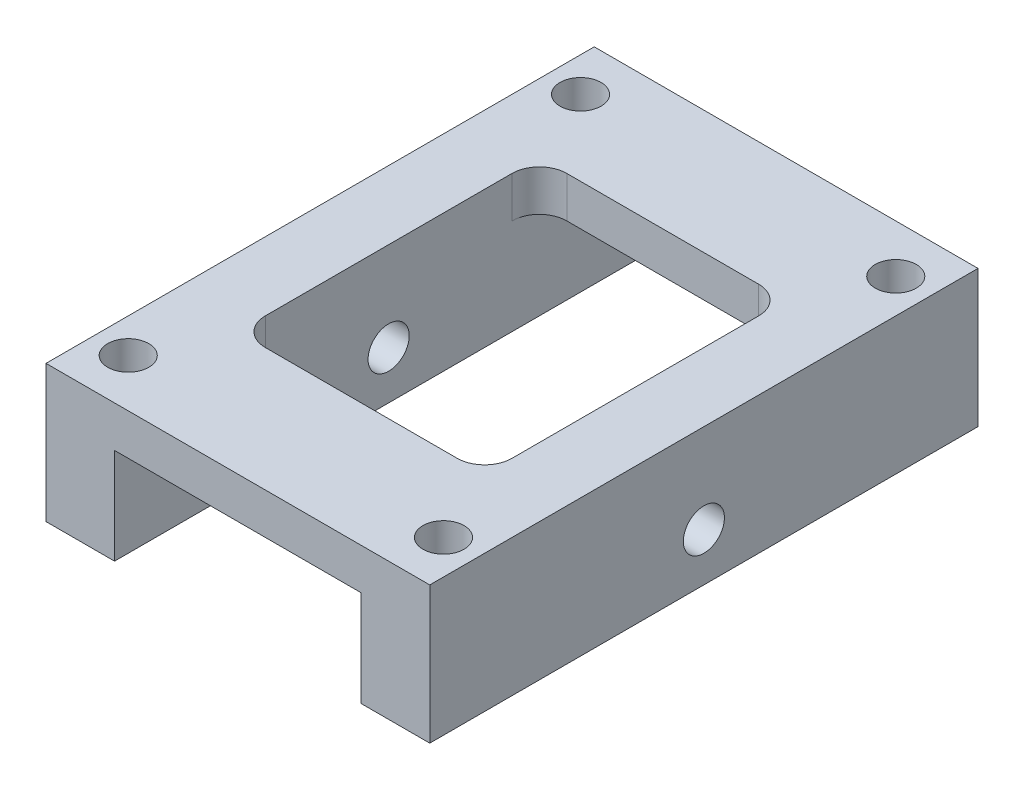
ISO-10303-21;
HEADER;
FILE_DESCRIPTION(('STEP AP214'),'2;1');
FILE_NAME('part.step','',(''),(''),'','','');
FILE_SCHEMA(('AUTOMOTIVE_DESIGN { 1 0 10303 214 1 1 1 1 }'));
ENDSEC;
DATA;
#1=APPLICATION_CONTEXT('core data for automotive mechanical design processes');
#2=APPLICATION_PROTOCOL_DEFINITION('international standard','automotive_design',2000,#1);
#3=PRODUCT_CONTEXT('',#1,'mechanical');
#4=PRODUCT('Part','Part','',(#3));
#5=PRODUCT_RELATED_PRODUCT_CATEGORY('part','',(#4));
#6=PRODUCT_DEFINITION_FORMATION('','',#4);
#7=PRODUCT_DEFINITION_CONTEXT('part definition',#1,'design');
#8=PRODUCT_DEFINITION('design','',#6,#7);
#9=PRODUCT_DEFINITION_SHAPE('','',#8);
#10=(LENGTH_UNIT() NAMED_UNIT(*) SI_UNIT(.MILLI.,.METRE.));
#11=(NAMED_UNIT(*) PLANE_ANGLE_UNIT() SI_UNIT($,.RADIAN.));
#12=(NAMED_UNIT(*) SI_UNIT($,.STERADIAN.) SOLID_ANGLE_UNIT());
#13=UNCERTAINTY_MEASURE_WITH_UNIT(LENGTH_MEASURE(1.E-05),#10,'distance_accuracy_value','');
#14=(GEOMETRIC_REPRESENTATION_CONTEXT(3) GLOBAL_UNCERTAINTY_ASSIGNED_CONTEXT((#13)) GLOBAL_UNIT_ASSIGNED_CONTEXT((#10,
#11,#12)) REPRESENTATION_CONTEXT('',''));
#15=CARTESIAN_POINT('',(0.,0.,0.));
#16=DIRECTION('',(0.,0.,1.));
#17=DIRECTION('',(1.,0.,0.));
#18=AXIS2_PLACEMENT_3D('',#15,#16,#17);
#19=CARTESIAN_POINT('',(23.,7.,40.));
#20=DIRECTION('',(0.,1.,0.));
#21=DIRECTION('',(-1.,0.,0.));
#22=AXIS2_PLACEMENT_3D('',#19,#20,#21);
#23=PLANE('',#22);
#24=DIRECTION('',(0.,0.,-1.));
#25=VECTOR('',#24,1.);
#26=CARTESIAN_POINT('',(5.,7.,40.));
#27=LINE('',#26,#25);
#28=CARTESIAN_POINT('',(5.,7.,40.));
#29=VERTEX_POINT('',#28);
#30=CARTESIAN_POINT('',(5.,7.,29.));
#31=VERTEX_POINT('',#30);
#32=EDGE_CURVE('E155',#29,#31,#27,.T.);
#33=ORIENTED_EDGE('',*,*,#32,.T.);
#34=CARTESIAN_POINT('',(7.,7.,29.));
#35=DIRECTION('',(0.,1.,0.));
#36=DIRECTION('',(-1.,0.,0.));
#37=AXIS2_PLACEMENT_3D('',#34,#35,#36);
#38=CIRCLE('',#37,2.);
#39=CARTESIAN_POINT('',(7.,7.,31.));
#40=VERTEX_POINT('',#39);
#41=EDGE_CURVE('E201',#31,#40,#38,.T.);
#42=ORIENTED_EDGE('',*,*,#41,.T.);
#43=DIRECTION('',(1.,0.,0.));
#44=VECTOR('',#43,1.);
#45=CARTESIAN_POINT('',(23.,7.,31.));
#46=LINE('',#45,#44);
#47=CARTESIAN_POINT('',(21.,7.,31.));
#48=VERTEX_POINT('',#47);
#49=EDGE_CURVE('E231',#40,#48,#46,.T.);
#50=ORIENTED_EDGE('',*,*,#49,.T.);
#51=CARTESIAN_POINT('',(21.,7.,29.));
#52=DIRECTION('',(0.,1.,0.));
#53=DIRECTION('',(-1.,0.,0.));
#54=AXIS2_PLACEMENT_3D('',#51,#52,#53);
#55=CIRCLE('',#54,2.);
#56=CARTESIAN_POINT('',(23.,7.,29.));
#57=VERTEX_POINT('',#56);
#58=EDGE_CURVE('E205',#48,#57,#55,.T.);
#59=ORIENTED_EDGE('',*,*,#58,.T.);
#60=DIRECTION('',(0.,0.,-1.));
#61=VECTOR('',#60,1.);
#62=CARTESIAN_POINT('',(23.,7.,40.));
#63=LINE('',#62,#61);
#64=CARTESIAN_POINT('',(23.,7.,40.));
#65=VERTEX_POINT('',#64);
#66=EDGE_CURVE('E316',#65,#57,#63,.T.);
#67=ORIENTED_EDGE('',*,*,#66,.F.);
#68=DIRECTION('',(1.,0.,0.));
#69=VECTOR('',#68,1.);
#70=CARTESIAN_POINT('',(23.,7.,40.));
#71=LINE('',#70,#69);
#72=EDGE_CURVE('E158',#29,#65,#71,.T.);
#73=ORIENTED_EDGE('',*,*,#72,.F.);
#74=EDGE_LOOP('',(#33,#42,#50,#59,#67,#73));
#75=FACE_BOUND('',#74,.T.);
#76=ADVANCED_FACE('F34',(#75),#23,.F.);
#77=CARTESIAN_POINT('',(5.,0.,40.));
#78=DIRECTION('',(0.,1.,0.));
#79=DIRECTION('',(-1.,0.,0.));
#80=AXIS2_PLACEMENT_3D('',#77,#78,#79);
#81=PLANE('',#80);
#82=CARTESIAN_POINT('',(2.5,0.,36.5));
#83=DIRECTION('',(0.,1.,0.));
#84=DIRECTION('',(-1.,0.,0.));
#85=AXIS2_PLACEMENT_3D('',#82,#83,#84);
#86=CIRCLE('',#85,1.5);
#87=CARTESIAN_POINT('',(1.,0.,36.5));
#88=VERTEX_POINT('',#87);
#89=EDGE_CURVE('E268',#88,#88,#86,.T.);
#90=ORIENTED_EDGE('',*,*,#89,.T.);
#91=EDGE_LOOP('',(#90));
#92=FACE_BOUND('',#91,.T.);
#93=CARTESIAN_POINT('',(2.5,0.,3.5));
#94=DIRECTION('',(0.,1.,0.));
#95=DIRECTION('',(-1.,0.,0.));
#96=AXIS2_PLACEMENT_3D('',#93,#94,#95);
#97=CIRCLE('',#96,1.5);
#98=CARTESIAN_POINT('',(1.,0.,3.5));
#99=VERTEX_POINT('',#98);
#100=EDGE_CURVE('E265',#99,#99,#97,.T.);
#101=ORIENTED_EDGE('',*,*,#100,.T.);
#102=EDGE_LOOP('',(#101));
#103=FACE_BOUND('',#102,.T.);
#104=DIRECTION('',(1.,0.,0.));
#105=VECTOR('',#104,1.);
#106=CARTESIAN_POINT('',(5.,0.,0.));
#107=LINE('',#106,#105);
#108=CARTESIAN_POINT('',(0.,0.,0.));
#109=VERTEX_POINT('',#108);
#110=CARTESIAN_POINT('',(5.,0.,0.));
#111=VERTEX_POINT('',#110);
#112=EDGE_CURVE('E173',#109,#111,#107,.T.);
#113=ORIENTED_EDGE('',*,*,#112,.T.);
#114=DIRECTION('',(0.,0.,-1.));
#115=VECTOR('',#114,1.);
#116=CARTESIAN_POINT('',(5.,0.,40.));
#117=LINE('',#116,#115);
#118=CARTESIAN_POINT('',(5.,0.,40.));
#119=VERTEX_POINT('',#118);
#120=EDGE_CURVE('E152',#119,#111,#117,.T.);
#121=ORIENTED_EDGE('',*,*,#120,.F.);
#122=DIRECTION('',(1.,0.,0.));
#123=VECTOR('',#122,1.);
#124=CARTESIAN_POINT('',(5.,0.,40.));
#125=LINE('',#124,#123);
#126=CARTESIAN_POINT('',(0.,0.,40.));
#127=VERTEX_POINT('',#126);
#128=EDGE_CURVE('E159',#127,#119,#125,.T.);
#129=ORIENTED_EDGE('',*,*,#128,.F.);
#130=DIRECTION('',(0.,0.,-1.));
#131=VECTOR('',#130,1.);
#132=CARTESIAN_POINT('',(0.,0.,40.));
#133=LINE('',#132,#131);
#134=EDGE_CURVE('E287',#127,#109,#133,.T.);
#135=ORIENTED_EDGE('',*,*,#134,.T.);
#136=EDGE_LOOP('',(#113,#121,#129,#135));
#137=FACE_BOUND('',#136,.T.);
#138=ADVANCED_FACE('F171',(#92,#103,#137),#81,.F.);
#139=CARTESIAN_POINT('',(5.,7.,40.));
#140=DIRECTION('',(-1.,0.,0.));
#141=DIRECTION('',(0.,0.,1.));
#142=AXIS2_PLACEMENT_3D('',#139,#140,#141);
#143=PLANE('',#142);
#144=DIRECTION('',(0.,0.,1.));
#145=VECTOR('',#144,1.);
#146=CARTESIAN_POINT('',(5.,10.,31.));
#147=LINE('',#146,#145);
#148=CARTESIAN_POINT('',(5.,10.,11.));
#149=VERTEX_POINT('',#148);
#150=CARTESIAN_POINT('',(5.,10.,29.));
#151=VERTEX_POINT('',#150);
#152=EDGE_CURVE('E238',#149,#151,#147,.T.);
#153=ORIENTED_EDGE('',*,*,#152,.T.);
#154=DIRECTION('',(0.,1.,0.));
#155=VECTOR('',#154,1.);
#156=CARTESIAN_POINT('',(5.,7.,29.));
#157=LINE('',#156,#155);
#158=EDGE_CURVE('E187',#151,#31,#157,.F.);
#159=ORIENTED_EDGE('',*,*,#158,.T.);
#160=ORIENTED_EDGE('',*,*,#32,.F.);
#161=DIRECTION('',(0.,1.,0.));
#162=VECTOR('',#161,1.);
#163=CARTESIAN_POINT('',(5.,7.,40.));
#164=LINE('',#163,#162);
#165=EDGE_CURVE('E145',#119,#29,#164,.T.);
#166=ORIENTED_EDGE('',*,*,#165,.F.);
#167=ORIENTED_EDGE('',*,*,#120,.T.);
#168=DIRECTION('',(0.,1.,0.));
#169=VECTOR('',#168,1.);
#170=CARTESIAN_POINT('',(5.,7.,0.));
#171=LINE('',#170,#169);
#172=CARTESIAN_POINT('',(5.,7.,0.));
#173=VERTEX_POINT('',#172);
#174=EDGE_CURVE('E289',#111,#173,#171,.T.);
#175=ORIENTED_EDGE('',*,*,#174,.T.);
#176=CARTESIAN_POINT('',(5.,7.,11.));
#177=VERTEX_POINT('',#176);
#178=EDGE_CURVE('E178',#177,#173,#27,.T.);
#179=ORIENTED_EDGE('',*,*,#178,.F.);
#180=DIRECTION('',(0.,1.,0.));
#181=VECTOR('',#180,1.);
#182=CARTESIAN_POINT('',(5.,10.,11.));
#183=LINE('',#182,#181);
#184=EDGE_CURVE('E184',#177,#149,#183,.T.);
#185=ORIENTED_EDGE('',*,*,#184,.T.);
#186=EDGE_LOOP('',(#153,#159,#160,#166,#167,#175,#179,#185));
#187=FACE_BOUND('',#186,.T.);
#188=CARTESIAN_POINT('',(5.,3.5,20.));
#189=DIRECTION('',(-1.,0.,0.));
#190=DIRECTION('',(0.,0.,1.));
#191=AXIS2_PLACEMENT_3D('',#188,#189,#190);
#192=CIRCLE('',#191,1.5);
#193=CARTESIAN_POINT('',(5.,3.5,21.5));
#194=VERTEX_POINT('',#193);
#195=EDGE_CURVE('E250',#194,#194,#192,.T.);
#196=ORIENTED_EDGE('',*,*,#195,.T.);
#197=EDGE_LOOP('',(#196));
#198=FACE_BOUND('',#197,.T.);
#199=ADVANCED_FACE('F148',(#187,#198),#143,.F.);
#200=CARTESIAN_POINT('',(23.,7.,11.));
#201=VERTEX_POINT('',#200);
#202=CARTESIAN_POINT('',(23.,7.,0.));
#203=VERTEX_POINT('',#202);
#204=EDGE_CURVE('E315',#201,#203,#63,.T.);
#205=ORIENTED_EDGE('',*,*,#204,.F.);
#206=CARTESIAN_POINT('',(21.,7.,11.));
#207=DIRECTION('',(0.,1.,0.));
#208=DIRECTION('',(-1.,0.,0.));
#209=AXIS2_PLACEMENT_3D('',#206,#207,#208);
#210=CIRCLE('',#209,2.);
#211=CARTESIAN_POINT('',(21.,7.,9.00000000000001));
#212=VERTEX_POINT('',#211);
#213=EDGE_CURVE('E11',#201,#212,#210,.T.);
#214=ORIENTED_EDGE('',*,*,#213,.T.);
#215=DIRECTION('',(-1.,0.,0.));
#216=VECTOR('',#215,1.);
#217=CARTESIAN_POINT('',(23.,7.,9.00000000000001));
#218=LINE('',#217,#216);
#219=CARTESIAN_POINT('',(7.,7.,9.));
#220=VERTEX_POINT('',#219);
#221=EDGE_CURVE('E229',#212,#220,#218,.T.);
#222=ORIENTED_EDGE('',*,*,#221,.T.);
#223=CARTESIAN_POINT('',(7.,7.,11.));
#224=DIRECTION('',(0.,1.,0.));
#225=DIRECTION('',(-1.,0.,0.));
#226=AXIS2_PLACEMENT_3D('',#223,#224,#225);
#227=CIRCLE('',#226,2.);
#228=EDGE_CURVE('E210',#220,#177,#227,.T.);
#229=ORIENTED_EDGE('',*,*,#228,.T.);
#230=ORIENTED_EDGE('',*,*,#178,.T.);
#231=DIRECTION('',(1.,0.,0.));
#232=VECTOR('',#231,1.);
#233=CARTESIAN_POINT('',(23.,7.,0.));
#234=LINE('',#233,#232);
#235=EDGE_CURVE('E291',#173,#203,#234,.T.);
#236=ORIENTED_EDGE('',*,*,#235,.T.);
#237=EDGE_LOOP('',(#205,#214,#222,#229,#230,#236));
#238=FACE_BOUND('',#237,.T.);
#239=ADVANCED_FACE('F323',(#238),#23,.F.);
#240=CARTESIAN_POINT('',(23.,0.,40.));
#241=DIRECTION('',(1.,0.,0.));
#242=DIRECTION('',(0.,1.,0.));
#243=AXIS2_PLACEMENT_3D('',#240,#241,#242);
#244=PLANE('',#243);
#245=ORIENTED_EDGE('',*,*,#66,.T.);
#246=DIRECTION('',(0.,1.,0.));
#247=VECTOR('',#246,1.);
#248=CARTESIAN_POINT('',(23.,10.,29.));
#249=LINE('',#248,#247);
#250=CARTESIAN_POINT('',(23.,10.,29.));
#251=VERTEX_POINT('',#250);
#252=EDGE_CURVE('E192',#57,#251,#249,.T.);
#253=ORIENTED_EDGE('',*,*,#252,.T.);
#254=DIRECTION('',(0.,0.,-1.));
#255=VECTOR('',#254,1.);
#256=CARTESIAN_POINT('',(23.,10.,31.));
#257=LINE('',#256,#255);
#258=CARTESIAN_POINT('',(23.,10.,11.));
#259=VERTEX_POINT('',#258);
#260=EDGE_CURVE('E218',#251,#259,#257,.T.);
#261=ORIENTED_EDGE('',*,*,#260,.T.);
#262=DIRECTION('',(0.,1.,0.));
#263=VECTOR('',#262,1.);
#264=CARTESIAN_POINT('',(23.,7.,11.));
#265=LINE('',#264,#263);
#266=EDGE_CURVE('E189',#259,#201,#265,.F.);
#267=ORIENTED_EDGE('',*,*,#266,.T.);
#268=ORIENTED_EDGE('',*,*,#204,.T.);
#269=DIRECTION('',(0.,-1.,0.));
#270=VECTOR('',#269,1.);
#271=CARTESIAN_POINT('',(23.,0.,0.));
#272=LINE('',#271,#270);
#273=CARTESIAN_POINT('',(23.,0.,0.));
#274=VERTEX_POINT('',#273);
#275=EDGE_CURVE('E294',#203,#274,#272,.T.);
#276=ORIENTED_EDGE('',*,*,#275,.T.);
#277=DIRECTION('',(0.,0.,-1.));
#278=VECTOR('',#277,1.);
#279=CARTESIAN_POINT('',(23.,0.,40.));
#280=LINE('',#279,#278);
#281=CARTESIAN_POINT('',(23.,0.,40.));
#282=VERTEX_POINT('',#281);
#283=EDGE_CURVE('E314',#282,#274,#280,.T.);
#284=ORIENTED_EDGE('',*,*,#283,.F.);
#285=DIRECTION('',(0.,-1.,0.));
#286=VECTOR('',#285,1.);
#287=CARTESIAN_POINT('',(23.,0.,40.));
#288=LINE('',#287,#286);
#289=EDGE_CURVE('E278',#65,#282,#288,.T.);
#290=ORIENTED_EDGE('',*,*,#289,.F.);
#291=EDGE_LOOP('',(#245,#253,#261,#267,#268,#276,#284,#290));
#292=FACE_BOUND('',#291,.T.);
#293=CARTESIAN_POINT('',(23.,3.5,20.));
#294=DIRECTION('',(1.,0.,0.));
#295=DIRECTION('',(0.,1.,0.));
#296=AXIS2_PLACEMENT_3D('',#293,#294,#295);
#297=CIRCLE('',#296,1.5);
#298=CARTESIAN_POINT('',(23.,5.,20.));
#299=VERTEX_POINT('',#298);
#300=EDGE_CURVE('E247',#299,#299,#297,.T.);
#301=ORIENTED_EDGE('',*,*,#300,.T.);
#302=EDGE_LOOP('',(#301));
#303=FACE_BOUND('',#302,.T.);
#304=ADVANCED_FACE('F224',(#292,#303),#244,.F.);
#305=CARTESIAN_POINT('',(28.,0.,40.));
#306=DIRECTION('',(0.,1.,0.));
#307=DIRECTION('',(-1.,0.,0.));
#308=AXIS2_PLACEMENT_3D('',#305,#306,#307);
#309=PLANE('',#308);
#310=CARTESIAN_POINT('',(25.5,0.,3.5));
#311=DIRECTION('',(0.,1.,0.));
#312=DIRECTION('',(-1.,0.,0.));
#313=AXIS2_PLACEMENT_3D('',#310,#311,#312);
#314=CIRCLE('',#313,1.5);
#315=CARTESIAN_POINT('',(24.,0.,3.5));
#316=VERTEX_POINT('',#315);
#317=EDGE_CURVE('E274',#316,#316,#314,.T.);
#318=ORIENTED_EDGE('',*,*,#317,.T.);
#319=EDGE_LOOP('',(#318));
#320=FACE_BOUND('',#319,.T.);
#321=CARTESIAN_POINT('',(25.5,0.,36.5));
#322=DIRECTION('',(0.,1.,0.));
#323=DIRECTION('',(-1.,0.,0.));
#324=AXIS2_PLACEMENT_3D('',#321,#322,#323);
#325=CIRCLE('',#324,1.5);
#326=CARTESIAN_POINT('',(24.,0.,36.5));
#327=VERTEX_POINT('',#326);
#328=EDGE_CURVE('E271',#327,#327,#325,.T.);
#329=ORIENTED_EDGE('',*,*,#328,.T.);
#330=EDGE_LOOP('',(#329));
#331=FACE_BOUND('',#330,.T.);
#332=DIRECTION('',(1.,0.,0.));
#333=VECTOR('',#332,1.);
#334=CARTESIAN_POINT('',(28.,0.,0.));
#335=LINE('',#334,#333);
#336=CARTESIAN_POINT('',(28.,0.,0.));
#337=VERTEX_POINT('',#336);
#338=EDGE_CURVE('E297',#274,#337,#335,.T.);
#339=ORIENTED_EDGE('',*,*,#338,.T.);
#340=DIRECTION('',(0.,0.,-1.));
#341=VECTOR('',#340,1.);
#342=CARTESIAN_POINT('',(28.,0.,40.));
#343=LINE('',#342,#341);
#344=CARTESIAN_POINT('',(28.,0.,40.));
#345=VERTEX_POINT('',#344);
#346=EDGE_CURVE('E311',#345,#337,#343,.T.);
#347=ORIENTED_EDGE('',*,*,#346,.F.);
#348=DIRECTION('',(1.,0.,0.));
#349=VECTOR('',#348,1.);
#350=CARTESIAN_POINT('',(28.,0.,40.));
#351=LINE('',#350,#349);
#352=EDGE_CURVE('E280',#282,#345,#351,.T.);
#353=ORIENTED_EDGE('',*,*,#352,.F.);
#354=ORIENTED_EDGE('',*,*,#283,.T.);
#355=EDGE_LOOP('',(#339,#347,#353,#354));
#356=FACE_BOUND('',#355,.T.);
#357=ADVANCED_FACE('F330',(#320,#331,#356),#309,.F.);
#358=CARTESIAN_POINT('',(28.,10.,40.));
#359=DIRECTION('',(-1.,0.,0.));
#360=DIRECTION('',(0.,-1.,0.));
#361=AXIS2_PLACEMENT_3D('',#358,#359,#360);
#362=PLANE('',#361);
#363=CARTESIAN_POINT('',(28.,3.5,20.));
#364=DIRECTION('',(-1.,0.,0.));
#365=DIRECTION('',(0.,-1.,0.));
#366=AXIS2_PLACEMENT_3D('',#363,#364,#365);
#367=CIRCLE('',#366,1.5);
#368=CARTESIAN_POINT('',(28.,2.,20.));
#369=VERTEX_POINT('',#368);
#370=EDGE_CURVE('E244',#369,#369,#367,.T.);
#371=ORIENTED_EDGE('',*,*,#370,.T.);
#372=EDGE_LOOP('',(#371));
#373=FACE_BOUND('',#372,.T.);
#374=DIRECTION('',(0.,1.,0.));
#375=VECTOR('',#374,1.);
#376=CARTESIAN_POINT('',(28.,10.,0.));
#377=LINE('',#376,#375);
#378=CARTESIAN_POINT('',(28.,10.,0.));
#379=VERTEX_POINT('',#378);
#380=EDGE_CURVE('E299',#337,#379,#377,.T.);
#381=ORIENTED_EDGE('',*,*,#380,.T.);
#382=DIRECTION('',(0.,0.,-1.));
#383=VECTOR('',#382,1.);
#384=CARTESIAN_POINT('',(28.,10.,40.));
#385=LINE('',#384,#383);
#386=CARTESIAN_POINT('',(28.,10.,40.));
#387=VERTEX_POINT('',#386);
#388=EDGE_CURVE('E308',#387,#379,#385,.T.);
#389=ORIENTED_EDGE('',*,*,#388,.F.);
#390=DIRECTION('',(0.,1.,0.));
#391=VECTOR('',#390,1.);
#392=CARTESIAN_POINT('',(28.,10.,40.));
#393=LINE('',#392,#391);
#394=EDGE_CURVE('E282',#345,#387,#393,.T.);
#395=ORIENTED_EDGE('',*,*,#394,.F.);
#396=ORIENTED_EDGE('',*,*,#346,.T.);
#397=EDGE_LOOP('',(#381,#389,#395,#396));
#398=FACE_BOUND('',#397,.T.);
#399=ADVANCED_FACE('F334',(#373,#398),#362,.F.);
#400=CARTESIAN_POINT('',(0.,10.,40.));
#401=DIRECTION('',(0.,-1.,0.));
#402=DIRECTION('',(0.,0.,-1.));
#403=AXIS2_PLACEMENT_3D('',#400,#401,#402);
#404=PLANE('',#403);
#405=DIRECTION('',(-1.,0.,0.));
#406=VECTOR('',#405,1.);
#407=CARTESIAN_POINT('',(5.,10.,9.));
#408=LINE('',#407,#406);
#409=CARTESIAN_POINT('',(21.,10.,9.00000000000001));
#410=VERTEX_POINT('',#409);
#411=CARTESIAN_POINT('',(7.,10.,9.));
#412=VERTEX_POINT('',#411);
#413=EDGE_CURVE('E219',#410,#412,#408,.T.);
#414=ORIENTED_EDGE('',*,*,#413,.F.);
#415=CARTESIAN_POINT('',(21.,10.,11.));
#416=DIRECTION('',(0.,-1.,0.));
#417=DIRECTION('',(0.,0.,-1.));
#418=AXIS2_PLACEMENT_3D('',#415,#416,#417);
#419=CIRCLE('',#418,2.);
#420=EDGE_CURVE('E42',#410,#259,#419,.T.);
#421=ORIENTED_EDGE('',*,*,#420,.T.);
#422=ORIENTED_EDGE('',*,*,#260,.F.);
#423=CARTESIAN_POINT('',(21.,10.,29.));
#424=DIRECTION('',(0.,-1.,0.));
#425=DIRECTION('',(0.,0.,-1.));
#426=AXIS2_PLACEMENT_3D('',#423,#424,#425);
#427=CIRCLE('',#426,2.);
#428=CARTESIAN_POINT('',(21.,10.,31.));
#429=VERTEX_POINT('',#428);
#430=EDGE_CURVE('E203',#251,#429,#427,.T.);
#431=ORIENTED_EDGE('',*,*,#430,.T.);
#432=DIRECTION('',(1.,0.,0.));
#433=VECTOR('',#432,1.);
#434=CARTESIAN_POINT('',(5.,10.,31.));
#435=LINE('',#434,#433);
#436=CARTESIAN_POINT('',(7.,10.,31.));
#437=VERTEX_POINT('',#436);
#438=EDGE_CURVE('E232',#437,#429,#435,.T.);
#439=ORIENTED_EDGE('',*,*,#438,.F.);
#440=CARTESIAN_POINT('',(7.,10.,29.));
#441=DIRECTION('',(0.,-1.,0.));
#442=DIRECTION('',(0.,0.,-1.));
#443=AXIS2_PLACEMENT_3D('',#440,#441,#442);
#444=CIRCLE('',#443,2.);
#445=EDGE_CURVE('E199',#437,#151,#444,.T.);
#446=ORIENTED_EDGE('',*,*,#445,.T.);
#447=ORIENTED_EDGE('',*,*,#152,.F.);
#448=CARTESIAN_POINT('',(7.,10.,11.));
#449=DIRECTION('',(0.,-1.,0.));
#450=DIRECTION('',(0.,0.,-1.));
#451=AXIS2_PLACEMENT_3D('',#448,#449,#450);
#452=CIRCLE('',#451,2.);
#453=EDGE_CURVE('E208',#149,#412,#452,.T.);
#454=ORIENTED_EDGE('',*,*,#453,.T.);
#455=EDGE_LOOP('',(#414,#421,#422,#431,#439,#446,#447,#454));
#456=FACE_BOUND('',#455,.T.);
#457=CARTESIAN_POINT('',(25.5,10.,3.5));
#458=DIRECTION('',(0.,1.,0.));
#459=DIRECTION('',(0.,0.,1.));
#460=AXIS2_PLACEMENT_3D('',#457,#458,#459);
#461=CIRCLE('',#460,1.5);
#462=CARTESIAN_POINT('',(25.5,10.,5.));
#463=VERTEX_POINT('',#462);
#464=EDGE_CURVE('E253',#463,#463,#461,.T.);
#465=ORIENTED_EDGE('',*,*,#464,.F.);
#466=EDGE_LOOP('',(#465));
#467=FACE_BOUND('',#466,.T.);
#468=CARTESIAN_POINT('',(25.5,10.,36.5));
#469=DIRECTION('',(0.,1.,0.));
#470=DIRECTION('',(0.,0.,1.));
#471=AXIS2_PLACEMENT_3D('',#468,#469,#470);
#472=CIRCLE('',#471,1.5);
#473=CARTESIAN_POINT('',(25.5,10.,38.));
#474=VERTEX_POINT('',#473);
#475=EDGE_CURVE('E258',#474,#474,#472,.T.);
#476=ORIENTED_EDGE('',*,*,#475,.F.);
#477=EDGE_LOOP('',(#476));
#478=FACE_BOUND('',#477,.T.);
#479=CARTESIAN_POINT('',(2.5,10.,36.5));
#480=DIRECTION('',(0.,1.,0.));
#481=DIRECTION('',(0.,0.,1.));
#482=AXIS2_PLACEMENT_3D('',#479,#480,#481);
#483=CIRCLE('',#482,1.5);
#484=CARTESIAN_POINT('',(2.5,10.,38.));
#485=VERTEX_POINT('',#484);
#486=EDGE_CURVE('E254',#485,#485,#483,.T.);
#487=ORIENTED_EDGE('',*,*,#486,.F.);
#488=EDGE_LOOP('',(#487));
#489=FACE_BOUND('',#488,.T.);
#490=CARTESIAN_POINT('',(2.5,10.,3.5));
#491=DIRECTION('',(0.,1.,0.));
#492=DIRECTION('',(0.,0.,1.));
#493=AXIS2_PLACEMENT_3D('',#490,#491,#492);
#494=CIRCLE('',#493,1.5);
#495=CARTESIAN_POINT('',(2.5,10.,5.));
#496=VERTEX_POINT('',#495);
#497=EDGE_CURVE('E257',#496,#496,#494,.T.);
#498=ORIENTED_EDGE('',*,*,#497,.F.);
#499=EDGE_LOOP('',(#498));
#500=FACE_BOUND('',#499,.T.);
#501=DIRECTION('',(-1.,0.,0.));
#502=VECTOR('',#501,1.);
#503=CARTESIAN_POINT('',(0.,10.,0.));
#504=LINE('',#503,#502);
#505=CARTESIAN_POINT('',(0.,10.,0.));
#506=VERTEX_POINT('',#505);
#507=EDGE_CURVE('E301',#379,#506,#504,.T.);
#508=ORIENTED_EDGE('',*,*,#507,.T.);
#509=DIRECTION('',(0.,0.,-1.));
#510=VECTOR('',#509,1.);
#511=CARTESIAN_POINT('',(0.,10.,40.));
#512=LINE('',#511,#510);
#513=CARTESIAN_POINT('',(0.,10.,40.));
#514=VERTEX_POINT('',#513);
#515=EDGE_CURVE('E305',#514,#506,#512,.T.);
#516=ORIENTED_EDGE('',*,*,#515,.F.);
#517=DIRECTION('',(-1.,0.,0.));
#518=VECTOR('',#517,1.);
#519=CARTESIAN_POINT('',(0.,10.,40.));
#520=LINE('',#519,#518);
#521=EDGE_CURVE('E284',#387,#514,#520,.T.);
#522=ORIENTED_EDGE('',*,*,#521,.F.);
#523=ORIENTED_EDGE('',*,*,#388,.T.);
#524=EDGE_LOOP('',(#508,#516,#522,#523));
#525=FACE_BOUND('',#524,.T.);
#526=ADVANCED_FACE('F216',(#456,#467,#478,#489,#500,#525),#404,.F.);
#527=CARTESIAN_POINT('',(0.,0.,40.));
#528=DIRECTION('',(1.,0.,0.));
#529=DIRECTION('',(0.,0.,-1.));
#530=AXIS2_PLACEMENT_3D('',#527,#528,#529);
#531=PLANE('',#530);
#532=CARTESIAN_POINT('',(0.,3.5,20.));
#533=DIRECTION('',(-1.,0.,0.));
#534=DIRECTION('',(0.,0.,1.));
#535=AXIS2_PLACEMENT_3D('',#532,#533,#534);
#536=CIRCLE('',#535,1.5);
#537=CARTESIAN_POINT('',(0.,3.5,21.5));
#538=VERTEX_POINT('',#537);
#539=EDGE_CURVE('E235',#538,#538,#536,.T.);
#540=ORIENTED_EDGE('',*,*,#539,.F.);
#541=EDGE_LOOP('',(#540));
#542=FACE_BOUND('',#541,.T.);
#543=DIRECTION('',(0.,-1.,0.));
#544=VECTOR('',#543,1.);
#545=CARTESIAN_POINT('',(0.,0.,0.));
#546=LINE('',#545,#544);
#547=EDGE_CURVE('E168',#506,#109,#546,.T.);
#548=ORIENTED_EDGE('',*,*,#547,.T.);
#549=ORIENTED_EDGE('',*,*,#134,.F.);
#550=DIRECTION('',(0.,-1.,0.));
#551=VECTOR('',#550,1.);
#552=CARTESIAN_POINT('',(0.,0.,40.));
#553=LINE('',#552,#551);
#554=EDGE_CURVE('E164',#514,#127,#553,.T.);
#555=ORIENTED_EDGE('',*,*,#554,.F.);
#556=ORIENTED_EDGE('',*,*,#515,.T.);
#557=EDGE_LOOP('',(#548,#549,#555,#556));
#558=FACE_BOUND('',#557,.T.);
#559=ADVANCED_FACE('F413',(#542,#558),#531,.F.);
#560=CARTESIAN_POINT('',(0.,0.,40.));
#561=DIRECTION('',(0.,0.,-1.));
#562=DIRECTION('',(-1.,0.,0.));
#563=AXIS2_PLACEMENT_3D('',#560,#561,#562);
#564=PLANE('',#563);
#565=ORIENTED_EDGE('',*,*,#128,.T.);
#566=ORIENTED_EDGE('',*,*,#165,.T.);
#567=ORIENTED_EDGE('',*,*,#72,.T.);
#568=ORIENTED_EDGE('',*,*,#289,.T.);
#569=ORIENTED_EDGE('',*,*,#352,.T.);
#570=ORIENTED_EDGE('',*,*,#394,.T.);
#571=ORIENTED_EDGE('',*,*,#521,.T.);
#572=ORIENTED_EDGE('',*,*,#554,.T.);
#573=EDGE_LOOP('',(#565,#566,#567,#568,#569,#570,#571,#572));
#574=FACE_BOUND('',#573,.T.);
#575=ADVANCED_FACE('F162',(#574),#564,.F.);
#576=CARTESIAN_POINT('',(0.,0.,0.));
#577=DIRECTION('',(0.,0.,-1.));
#578=DIRECTION('',(-1.,0.,0.));
#579=AXIS2_PLACEMENT_3D('',#576,#577,#578);
#580=PLANE('',#579);
#581=ORIENTED_EDGE('',*,*,#112,.F.);
#582=ORIENTED_EDGE('',*,*,#547,.F.);
#583=ORIENTED_EDGE('',*,*,#507,.F.);
#584=ORIENTED_EDGE('',*,*,#380,.F.);
#585=ORIENTED_EDGE('',*,*,#338,.F.);
#586=ORIENTED_EDGE('',*,*,#275,.F.);
#587=ORIENTED_EDGE('',*,*,#235,.F.);
#588=ORIENTED_EDGE('',*,*,#174,.F.);
#589=EDGE_LOOP('',(#581,#582,#583,#584,#585,#586,#587,#588));
#590=FACE_BOUND('',#589,.T.);
#591=ADVANCED_FACE('F325',(#590),#580,.T.);
#592=CARTESIAN_POINT('',(2.5,-30.,3.5));
#593=DIRECTION('',(0.,1.,0.));
#594=DIRECTION('',(0.,0.,1.));
#595=AXIS2_PLACEMENT_3D('',#592,#593,#594);
#596=CYLINDRICAL_SURFACE('',#595,1.5);
#597=ORIENTED_EDGE('',*,*,#497,.T.);
#598=EDGE_LOOP('',(#597));
#599=FACE_BOUND('',#598,.T.);
#600=ORIENTED_EDGE('',*,*,#100,.F.);
#601=EDGE_LOOP('',(#600));
#602=FACE_BOUND('',#601,.T.);
#603=ADVANCED_FACE('F400',(#599,#602),#596,.F.);
#604=CARTESIAN_POINT('',(2.5,-30.,36.5));
#605=DIRECTION('',(0.,1.,0.));
#606=DIRECTION('',(0.,0.,1.));
#607=AXIS2_PLACEMENT_3D('',#604,#605,#606);
#608=CYLINDRICAL_SURFACE('',#607,1.5);
#609=ORIENTED_EDGE('',*,*,#486,.T.);
#610=EDGE_LOOP('',(#609));
#611=FACE_BOUND('',#610,.T.);
#612=ORIENTED_EDGE('',*,*,#89,.F.);
#613=EDGE_LOOP('',(#612));
#614=FACE_BOUND('',#613,.T.);
#615=ADVANCED_FACE('F396',(#611,#614),#608,.F.);
#616=CARTESIAN_POINT('',(25.5,-30.,36.5));
#617=DIRECTION('',(0.,1.,0.));
#618=DIRECTION('',(0.,0.,1.));
#619=AXIS2_PLACEMENT_3D('',#616,#617,#618);
#620=CYLINDRICAL_SURFACE('',#619,1.5);
#621=ORIENTED_EDGE('',*,*,#475,.T.);
#622=EDGE_LOOP('',(#621));
#623=FACE_BOUND('',#622,.T.);
#624=ORIENTED_EDGE('',*,*,#328,.F.);
#625=EDGE_LOOP('',(#624));
#626=FACE_BOUND('',#625,.T.);
#627=ADVANCED_FACE('F399',(#623,#626),#620,.F.);
#628=CARTESIAN_POINT('',(25.5,-30.,3.5));
#629=DIRECTION('',(0.,1.,0.));
#630=DIRECTION('',(0.,0.,1.));
#631=AXIS2_PLACEMENT_3D('',#628,#629,#630);
#632=CYLINDRICAL_SURFACE('',#631,1.5);
#633=ORIENTED_EDGE('',*,*,#464,.T.);
#634=EDGE_LOOP('',(#633));
#635=FACE_BOUND('',#634,.T.);
#636=ORIENTED_EDGE('',*,*,#317,.F.);
#637=EDGE_LOOP('',(#636));
#638=FACE_BOUND('',#637,.T.);
#639=ADVANCED_FACE('F394',(#635,#638),#632,.F.);
#640=CARTESIAN_POINT('',(40.,3.5,20.));
#641=DIRECTION('',(-1.,0.,0.));
#642=DIRECTION('',(0.,0.,1.));
#643=AXIS2_PLACEMENT_3D('',#640,#641,#642);
#644=CYLINDRICAL_SURFACE('',#643,1.5);
#645=ORIENTED_EDGE('',*,*,#539,.T.);
#646=EDGE_LOOP('',(#645));
#647=FACE_BOUND('',#646,.T.);
#648=ORIENTED_EDGE('',*,*,#195,.F.);
#649=EDGE_LOOP('',(#648));
#650=FACE_BOUND('',#649,.T.);
#651=ADVANCED_FACE('F391',(#647,#650),#644,.F.);
#652=ORIENTED_EDGE('',*,*,#370,.F.);
#653=EDGE_LOOP('',(#652));
#654=FACE_BOUND('',#653,.T.);
#655=ORIENTED_EDGE('',*,*,#300,.F.);
#656=EDGE_LOOP('',(#655));
#657=FACE_BOUND('',#656,.T.);
#658=ADVANCED_FACE('F388',(#654,#657),#644,.F.);
#659=CARTESIAN_POINT('',(5.,0.,31.));
#660=DIRECTION('',(0.,0.,1.));
#661=DIRECTION('',(1.,0.,0.));
#662=AXIS2_PLACEMENT_3D('',#659,#660,#661);
#663=PLANE('',#662);
#664=ORIENTED_EDGE('',*,*,#49,.F.);
#665=DIRECTION('',(0.,1.,0.));
#666=VECTOR('',#665,1.);
#667=CARTESIAN_POINT('',(7.,10.,31.));
#668=LINE('',#667,#666);
#669=EDGE_CURVE('E176',#40,#437,#668,.T.);
#670=ORIENTED_EDGE('',*,*,#669,.T.);
#671=ORIENTED_EDGE('',*,*,#438,.T.);
#672=DIRECTION('',(0.,1.,0.));
#673=VECTOR('',#672,1.);
#674=CARTESIAN_POINT('',(21.,7.,31.));
#675=LINE('',#674,#673);
#676=EDGE_CURVE('E174',#429,#48,#675,.F.);
#677=ORIENTED_EDGE('',*,*,#676,.T.);
#678=EDGE_LOOP('',(#664,#670,#671,#677));
#679=FACE_BOUND('',#678,.T.);
#680=ADVANCED_FACE('F346',(#679),#663,.F.);
#681=CARTESIAN_POINT('',(5.,0.,9.));
#682=DIRECTION('',(0.,0.,-1.));
#683=DIRECTION('',(-1.,0.,0.));
#684=AXIS2_PLACEMENT_3D('',#681,#682,#683);
#685=PLANE('',#684);
#686=ORIENTED_EDGE('',*,*,#413,.T.);
#687=DIRECTION('',(0.,1.,0.));
#688=VECTOR('',#687,1.);
#689=CARTESIAN_POINT('',(7.,7.,9.));
#690=LINE('',#689,#688);
#691=EDGE_CURVE('E49',#412,#220,#690,.F.);
#692=ORIENTED_EDGE('',*,*,#691,.T.);
#693=ORIENTED_EDGE('',*,*,#221,.F.);
#694=DIRECTION('',(0.,1.,0.));
#695=VECTOR('',#694,1.);
#696=CARTESIAN_POINT('',(21.,10.,9.00000000000001));
#697=LINE('',#696,#695);
#698=EDGE_CURVE('E195',#212,#410,#697,.T.);
#699=ORIENTED_EDGE('',*,*,#698,.T.);
#700=EDGE_LOOP('',(#686,#692,#693,#699));
#701=FACE_BOUND('',#700,.T.);
#702=ADVANCED_FACE('F228',(#701),#685,.F.);
#703=CARTESIAN_POINT('',(7.,0.,29.));
#704=DIRECTION('',(0.,-1.,0.));
#705=DIRECTION('',(0.,0.,-1.));
#706=AXIS2_PLACEMENT_3D('',#703,#704,#705);
#707=CYLINDRICAL_SURFACE('',#706,2.);
#708=ORIENTED_EDGE('',*,*,#41,.F.);
#709=ORIENTED_EDGE('',*,*,#158,.F.);
#710=ORIENTED_EDGE('',*,*,#445,.F.);
#711=ORIENTED_EDGE('',*,*,#669,.F.);
#712=EDGE_LOOP('',(#708,#709,#710,#711));
#713=FACE_BOUND('',#712,.T.);
#714=ADVANCED_FACE('F350',(#713),#707,.F.);
#715=CARTESIAN_POINT('',(21.,0.,29.));
#716=DIRECTION('',(0.,-1.,0.));
#717=DIRECTION('',(1.,0.,0.));
#718=AXIS2_PLACEMENT_3D('',#715,#716,#717);
#719=CYLINDRICAL_SURFACE('',#718,2.);
#720=ORIENTED_EDGE('',*,*,#58,.F.);
#721=ORIENTED_EDGE('',*,*,#676,.F.);
#722=ORIENTED_EDGE('',*,*,#430,.F.);
#723=ORIENTED_EDGE('',*,*,#252,.F.);
#724=EDGE_LOOP('',(#720,#721,#722,#723));
#725=FACE_BOUND('',#724,.T.);
#726=ADVANCED_FACE('F343',(#725),#719,.F.);
#727=CARTESIAN_POINT('',(7.,7.,11.));
#728=DIRECTION('',(0.,-1.,0.));
#729=DIRECTION('',(0.,0.,-1.));
#730=AXIS2_PLACEMENT_3D('',#727,#728,#729);
#731=CYLINDRICAL_SURFACE('',#730,2.);
#732=ORIENTED_EDGE('',*,*,#228,.F.);
#733=ORIENTED_EDGE('',*,*,#691,.F.);
#734=ORIENTED_EDGE('',*,*,#453,.F.);
#735=ORIENTED_EDGE('',*,*,#184,.F.);
#736=EDGE_LOOP('',(#732,#733,#734,#735));
#737=FACE_BOUND('',#736,.T.);
#738=ADVANCED_FACE('F356',(#737),#731,.F.);
#739=CARTESIAN_POINT('',(21.,0.,11.));
#740=DIRECTION('',(0.,-1.,0.));
#741=DIRECTION('',(1.,0.,0.));
#742=AXIS2_PLACEMENT_3D('',#739,#740,#741);
#743=CYLINDRICAL_SURFACE('',#742,2.);
#744=ORIENTED_EDGE('',*,*,#213,.F.);
#745=ORIENTED_EDGE('',*,*,#266,.F.);
#746=ORIENTED_EDGE('',*,*,#420,.F.);
#747=ORIENTED_EDGE('',*,*,#698,.F.);
#748=EDGE_LOOP('',(#744,#745,#746,#747));
#749=FACE_BOUND('',#748,.T.);
#750=ADVANCED_FACE('F36',(#749),#743,.F.);
#751=CLOSED_SHELL('',(#76,#138,#199,#239,#304,#357,#399,#526,#559,#575,#591,#603,#615,#627,#639,
#651,#658,#680,#702,#714,#726,#738,#750));
#752=MANIFOLD_SOLID_BREP('B2',#751);
#753=ADVANCED_BREP_SHAPE_REPRESENTATION('',(#18,#752),#14);
#754=SHAPE_DEFINITION_REPRESENTATION(#9,#753);
ENDSEC;
END-ISO-10303-21;
